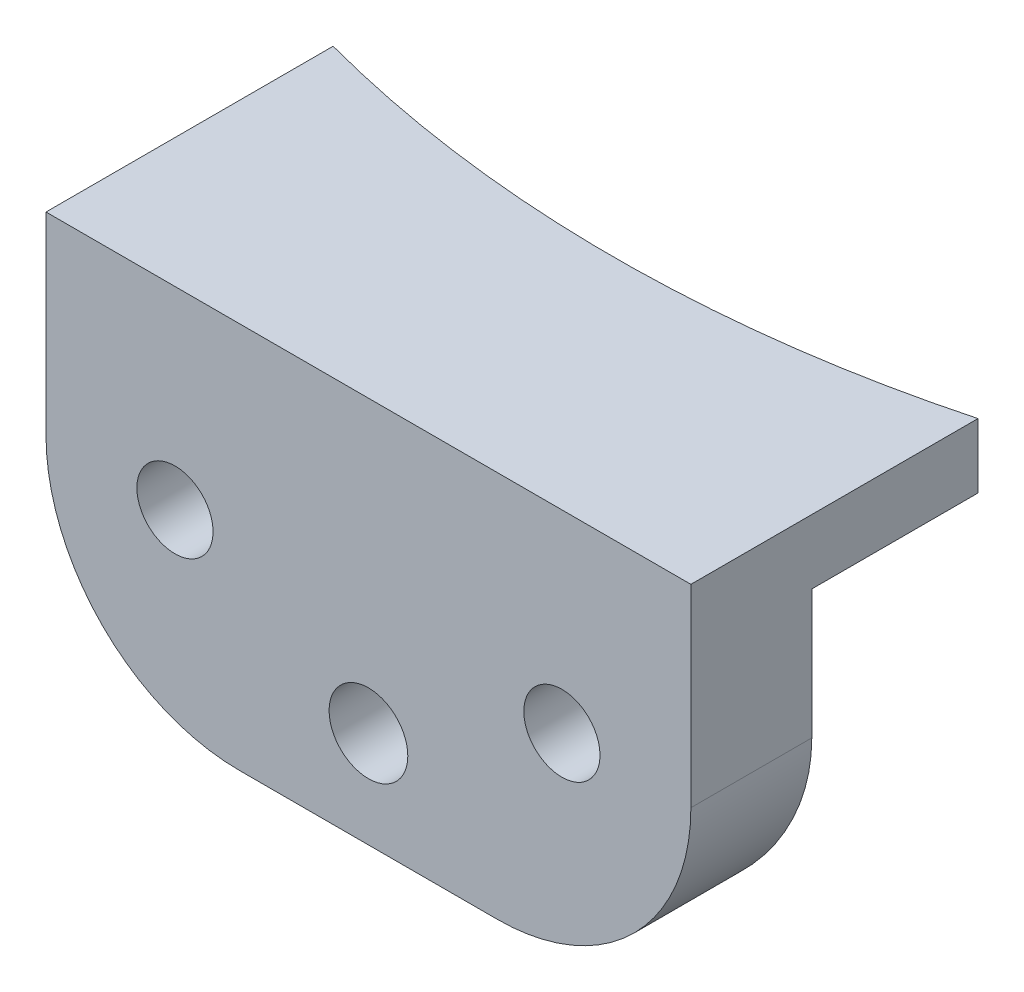
ISO-10303-21;
HEADER;
FILE_DESCRIPTION(('STEP AP214'),'2;1');
FILE_NAME('part.step','',(''),(''),'','','');
FILE_SCHEMA(('AUTOMOTIVE_DESIGN { 1 0 10303 214 1 1 1 1 }'));
ENDSEC;
DATA;
#1=APPLICATION_CONTEXT('core data for automotive mechanical design processes');
#2=APPLICATION_PROTOCOL_DEFINITION('international standard','automotive_design',2000,#1);
#3=PRODUCT_CONTEXT('',#1,'mechanical');
#4=PRODUCT('Part','Part','',(#3));
#5=PRODUCT_RELATED_PRODUCT_CATEGORY('part','',(#4));
#6=PRODUCT_DEFINITION_FORMATION('','',#4);
#7=PRODUCT_DEFINITION_CONTEXT('part definition',#1,'design');
#8=PRODUCT_DEFINITION('design','',#6,#7);
#9=PRODUCT_DEFINITION_SHAPE('','',#8);
#10=(LENGTH_UNIT() NAMED_UNIT(*) SI_UNIT(.MILLI.,.METRE.));
#11=(NAMED_UNIT(*) PLANE_ANGLE_UNIT() SI_UNIT($,.RADIAN.));
#12=(NAMED_UNIT(*) SI_UNIT($,.STERADIAN.) SOLID_ANGLE_UNIT());
#13=UNCERTAINTY_MEASURE_WITH_UNIT(LENGTH_MEASURE(1.E-05),#10,'distance_accuracy_value','');
#14=(GEOMETRIC_REPRESENTATION_CONTEXT(3) GLOBAL_UNCERTAINTY_ASSIGNED_CONTEXT((#13)) GLOBAL_UNIT_ASSIGNED_CONTEXT((#10,
#11,#12)) REPRESENTATION_CONTEXT('',''));
#15=CARTESIAN_POINT('',(0.,0.,0.));
#16=DIRECTION('',(0.,0.,1.));
#17=DIRECTION('',(1.,0.,0.));
#18=AXIS2_PLACEMENT_3D('',#15,#16,#17);
#19=CARTESIAN_POINT('',(0.,12.7,0.));
#20=DIRECTION('',(0.,-1.,0.));
#21=DIRECTION('',(0.,0.,-1.));
#22=AXIS2_PLACEMENT_3D('',#19,#20,#21);
#23=CYLINDRICAL_SURFACE('',#22,55.5625);
#24=CARTESIAN_POINT('',(-9.120000048,7.62,54.8089135576913));
#25=CARTESIAN_POINT('',(-9.11999621102808,7.53655292794151,54.808914369063));
#26=CARTESIAN_POINT('',(-9.1130116596539,7.45304518503125,54.8100778183066));
#27=CARTESIAN_POINT('',(-9.08526335183245,7.28834719222203,54.8146840362341));
#28=CARTESIAN_POINT('',(-9.06448303718543,7.20715984964252,54.8181295439196));
#29=CARTESIAN_POINT('',(-9.00978951623179,7.04952957992192,54.8271453048958));
#30=CARTESIAN_POINT('',(-8.97588675838436,6.97308293414909,54.8327138676975));
#31=CARTESIAN_POINT('',(-8.89597088898424,6.82701224277382,54.8457358352249));
#32=CARTESIAN_POINT('',(-8.84996036921445,6.75738674141171,54.853188836555));
#33=CARTESIAN_POINT('',(-8.74682308996114,6.62638789473792,54.8697296303837));
#34=CARTESIAN_POINT('',(-8.68962455877084,6.56507240342277,54.8788279476088));
#35=CARTESIAN_POINT('',(-8.56594689860326,6.45288523053285,54.8982683825637));
#36=CARTESIAN_POINT('',(-8.49946685646346,6.40201457779287,54.9086106226632));
#37=CARTESIAN_POINT('',(-8.35821882624504,6.31150671653882,54.9302898588455));
#38=CARTESIAN_POINT('',(-8.28335874462302,6.27201576909301,54.9416375490693));
#39=CARTESIAN_POINT('',(-8.12813648430618,6.20617332052651,54.9648156252162));
#40=CARTESIAN_POINT('',(-8.04777401183393,6.17982252159284,54.9766460368985));
#41=CARTESIAN_POINT('',(-7.8830581811966,6.14080220393394,55.0005070953716));
#42=CARTESIAN_POINT('',(-7.79867596702962,6.12825489872769,55.0125385882068));
#43=CARTESIAN_POINT('',(-7.62896594577147,6.11761900363238,55.0363300566384));
#44=CARTESIAN_POINT('',(-7.54363812546803,6.11953061602213,55.048090028434));
#45=CARTESIAN_POINT('',(-7.37433852769907,6.13780253147227,55.0710254674379));
#46=CARTESIAN_POINT('',(-7.2903688021426,6.1541829339868,55.0822000986314));
#47=CARTESIAN_POINT('',(-7.12632355167266,6.20100076410465,55.1036638158295));
#48=CARTESIAN_POINT('',(-7.04624794739732,6.23143790510002,55.1139529198842));
#49=CARTESIAN_POINT('',(-6.89271328707526,6.30536049481368,55.1333644387822));
#50=CARTESIAN_POINT('',(-6.81922296201439,6.3487795088301,55.1424924642665));
#51=CARTESIAN_POINT('',(-6.68056246771594,6.44752373717422,55.1594631773026));
#52=CARTESIAN_POINT('',(-6.61539196462234,6.50284847351224,55.1673059164337));
#53=CARTESIAN_POINT('',(-6.4957676937025,6.62337769766718,55.1815188053812));
#54=CARTESIAN_POINT('',(-6.44123536603558,6.68850293621306,55.1878998159094));
#55=CARTESIAN_POINT('',(-6.34388050871682,6.82710021048834,55.1991756824329));
#56=CARTESIAN_POINT('',(-6.30105753347552,6.90057192844891,55.2040705949811));
#57=CARTESIAN_POINT('',(-6.22864679112167,7.05323280696333,55.2122874979561));
#58=CARTESIAN_POINT('',(-6.19897041654829,7.13237937913618,55.2156200279374));
#59=CARTESIAN_POINT('',(-6.15330431731042,7.29457488825311,55.220727855855));
#60=CARTESIAN_POINT('',(-6.13731423122947,7.37762372208832,55.2225031949124));
#61=CARTESIAN_POINT('',(-6.11953242671802,7.54489110175352,55.2244765509917));
#62=CARTESIAN_POINT('',(-6.11768119187929,7.62910324784874,55.224681179816));
#63=CARTESIAN_POINT('',(-6.12807442800056,7.7966416528179,55.2235288297159));
#64=CARTESIAN_POINT('',(-6.14031873380357,7.8799679220601,55.2221718690886));
#65=CARTESIAN_POINT('',(-6.17852065635988,8.04327528197983,55.2179106240388));
#66=CARTESIAN_POINT('',(-6.2044630596534,8.12325997775687,55.2150080561771));
#67=CARTESIAN_POINT('',(-6.26929091435104,8.27772387211562,55.2076847510786));
#68=CARTESIAN_POINT('',(-6.308176410796,8.35220305153752,55.2032640085586));
#69=CARTESIAN_POINT('',(-6.39784706286642,8.49371212941183,55.1929433196978));
#70=CARTESIAN_POINT('',(-6.44865607028759,8.56072669413083,55.1870404067448));
#71=CARTESIAN_POINT('',(-6.56065466948054,8.68527081342173,55.1738378929584));
#72=CARTESIAN_POINT('',(-6.62184447729637,8.7428001705394,55.1665382630562));
#73=CARTESIAN_POINT('',(-6.7531756981385,8.84706174142647,55.1506157082599));
#74=CARTESIAN_POINT('',(-6.82336057399495,8.89373821129063,55.1419863142163));
#75=CARTESIAN_POINT('',(-6.97042707443464,8.97465871653877,55.1235887639194));
#76=CARTESIAN_POINT('',(-7.04730893701326,9.00890230986346,55.1138205671916));
#77=CARTESIAN_POINT('',(-7.20617478495063,9.06425610064247,55.0932746083916));
#78=CARTESIAN_POINT('',(-7.28819189011866,9.08526869760745,55.082490003281));
#79=CARTESIAN_POINT('',(-7.45449870124348,9.1132248258205,55.0602296795355));
#80=CARTESIAN_POINT('',(-7.53878851298812,9.12016770101464,55.0487539286989));
#81=CARTESIAN_POINT('',(-7.70790703337021,9.11982498652059,55.0253297617587));
#82=CARTESIAN_POINT('',(-7.79273514244896,9.11243430139356,55.0133784885212));
#83=CARTESIAN_POINT('',(-7.9599222586588,9.0834383218984,54.9894369745559));
#84=CARTESIAN_POINT('',(-8.04228118166594,9.06183254380326,54.9774467325159));
#85=CARTESIAN_POINT('',(-8.20251248595899,9.0048953100707,54.9537695066501));
#86=CARTESIAN_POINT('',(-8.28036696096295,8.96951289010585,54.9420838227698));
#87=CARTESIAN_POINT('',(-8.42902662111341,8.88599529703487,54.9194735625234));
#88=CARTESIAN_POINT('',(-8.49983211477352,8.83786068239349,54.9085489528536));
#89=CARTESIAN_POINT('',(-8.63211008475951,8.73034793692299,54.8879090112642));
#90=CARTESIAN_POINT('',(-8.69361404857573,8.67100934107989,54.8781896205283));
#91=CARTESIAN_POINT('',(-8.80577532143928,8.5426066930263,54.8603040664231));
#92=CARTESIAN_POINT('',(-8.85643049777756,8.47354073297715,54.8521382084902));
#93=CARTESIAN_POINT('',(-8.94489321851712,8.3283882145074,54.8377815608655));
#94=CARTESIAN_POINT('',(-8.98282289441274,8.25237786164905,54.8315720329315));
#95=CARTESIAN_POINT('',(-9.04532009021431,8.09498807123796,54.8212969927782));
#96=CARTESIAN_POINT('',(-9.06990496559453,8.01361576242395,54.8172286960081));
#97=CARTESIAN_POINT('',(-9.09826396206031,7.87974052414636,54.8125269419358));
#98=CARTESIAN_POINT('',(-9.1064040030245,7.82814671964131,54.8111744368208));
#99=CARTESIAN_POINT('',(-9.11727322486417,7.72437652074445,54.8093674944471));
#100=CARTESIAN_POINT('',(-9.12000244820928,7.6722001309286,54.8089130501396));
#101=CARTESIAN_POINT('',(-9.120000048,7.62,54.8089135576913));
#102=B_SPLINE_CURVE_WITH_KNOTS('',3,(#24,#25,#26,#27,#28,#29,#30,#31,#32,#33,#34,#35,#36,#37,
#38,#39,#40,#41,#42,#43,#44,#45,#46,#47,#48,#49,#50,#51,#52,#53,#54,#55,#56,#57,#58,#59,#60,#61,
#62,#63,#64,#65,#66,#67,#68,#69,#70,#71,#72,#73,#74,#75,#76,#77,#78,#79,#80,#81,#82,#83,#84,#85,
#86,#87,#88,#89,#90,#91,#92,#93,#94,#95,#96,#97,#98,#99,#100,#101),.UNSPECIFIED.,.T.,.F.,(4,2,2,
2,2,2,2,2,2,2,2,2,2,2,2,2,2,2,2,2,2,2,2,2,2,2,2,2,2,2,2,2,2,2,2,2,2,2,4),(0.,0.25014922180014,
0.500599226325257,0.750850224360897,1.00104769727693,1.25290620658383,1.5047895125035,
1.75977892062891,2.01478195349161,2.27202500441455,2.52927165414888,2.78687622345695,
3.04447554060371,3.30077852312593,3.5570712175423,3.81139296637141,4.06570503585497,
4.31827595943153,4.57084021311309,4.82234072788359,5.07383829586088,5.32505712986663,
5.5762768381013,5.82800343577831,6.0797352730038,6.33273285068457,6.58573942298331,
6.84059112192356,7.09545470401358,7.35219404373389,7.60894212051832,7.86664915756444,
8.12434491055195,8.38114778587567,8.63800109855182,8.892313630998,9.14629462198522,
9.3027761413471,9.45925643247705),.UNSPECIFIED.);
#103=CARTESIAN_POINT('',(-9.120000048,7.62,54.8089135576913));
#104=VERTEX_POINT('',#103);
#105=EDGE_CURVE('E196',#104,#104,#102,.T.);
#106=ORIENTED_EDGE('',*,*,#105,.T.);
#107=EDGE_LOOP('',(#106));
#108=FACE_BOUND('',#107,.T.);
#109=DIRECTION('',(0.,-1.,0.));
#110=VECTOR('',#109,1.);
#111=CARTESIAN_POINT('',(12.7,12.7,54.0916019937476));
#112=LINE('',#111,#110);
#113=CARTESIAN_POINT('',(12.7,12.7,54.0916019937476));
#114=VERTEX_POINT('',#113);
#115=CARTESIAN_POINT('',(12.7,7.62,54.0916019937476));
#116=VERTEX_POINT('',#115);
#117=EDGE_CURVE('E205',#114,#116,#112,.T.);
#118=ORIENTED_EDGE('',*,*,#117,.T.);
#119=CARTESIAN_POINT('',(12.7,7.62,54.0916019937476));
#120=CARTESIAN_POINT('',(12.7000260383111,7.40909228251088,54.0915864318553));
#121=CARTESIAN_POINT('',(12.691244830027,7.19819127799072,54.0936573082442));
#122=CARTESIAN_POINT('',(12.6562582443714,6.77794544077424,54.1018588325241));
#123=CARTESIAN_POINT('',(12.6300551259228,6.56860040988843,54.1079889540934));
#124=CARTESIAN_POINT('',(12.560474630859,6.15330998488749,54.1241820295825));
#125=CARTESIAN_POINT('',(12.5171267660357,5.94735937909786,54.134238225046));
#126=CARTESIAN_POINT('',(12.4136180909257,5.5399487376661,54.158067992428));
#127=CARTESIAN_POINT('',(12.3534572014027,5.33848872319204,54.1718415818658));
#128=CARTESIAN_POINT('',(12.2168079532542,4.94148525143272,54.2028219480953));
#129=CARTESIAN_POINT('',(12.1403214745008,4.74594111589849,54.2200283295903));
#130=CARTESIAN_POINT('',(11.9715783381805,4.36200444670588,54.2575357674463));
#131=CARTESIAN_POINT('',(11.879315869091,4.17361457988681,54.2778379639371));
#132=CARTESIAN_POINT('',(11.6797396456503,3.80533099853923,54.3211331557491));
#133=CARTESIAN_POINT('',(11.5724271486034,3.62543657596365,54.3441259262686));
#134=CARTESIAN_POINT('',(11.3435177564406,3.27529069917125,54.3923679206215));
#135=CARTESIAN_POINT('',(11.2219202556919,3.10503965425281,54.4176172401135));
#136=CARTESIAN_POINT('',(10.9633778569664,2.77281235446111,54.4702984176426));
#137=CARTESIAN_POINT('',(10.8262309491043,2.61099756682606,54.4977572300912));
#138=CARTESIAN_POINT('',(10.5390618609498,2.29948099987531,54.5540189504993));
#139=CARTESIAN_POINT('',(10.3890395653597,2.14977932905461,54.582821870494));
#140=CARTESIAN_POINT('',(10.0771038349884,1.8634220081827,54.6412716227664));
#141=CARTESIAN_POINT('',(9.91518741183268,1.72676965671743,54.6709186659745));
#142=CARTESIAN_POINT('',(9.58058466826317,1.46744437189491,54.7305461139997));
#143=CARTESIAN_POINT('',(9.4078984566224,1.34477129738477,54.7605265154474));
#144=CARTESIAN_POINT('',(9.04939130935338,1.11193492361699,54.8209230629937));
#145=CARTESIAN_POINT('',(8.86337847874969,1.00206611026263,54.8513361394482));
#146=CARTESIAN_POINT('',(8.48268523645505,0.798510974926254,54.9114977279068));
#147=CARTESIAN_POINT('',(8.28800786856427,0.704819025671001,54.9412464678585));
#148=CARTESIAN_POINT('',(7.89131299014792,0.534274703167012,54.9996249202243));
#149=CARTESIAN_POINT('',(7.68929784430577,0.457416960058029,55.0282549870771));
#150=CARTESIAN_POINT('',(7.27936153832026,0.321103346367203,55.0839825765294));
#151=CARTESIAN_POINT('',(7.07144172028111,0.261643555497589,55.1110804432681));
#152=CARTESIAN_POINT('',(6.57017863524608,0.141148151241185,55.1734529444688));
#153=CARTESIAN_POINT('',(6.27469938158129,0.0882796324289929,55.2078704229079));
#154=CARTESIAN_POINT('',(5.82835833976299,0.0353549150312618,55.2561682371208));
#155=CARTESIAN_POINT('',(5.67910944207982,0.0221097115495181,55.2717080069023));
#156=CARTESIAN_POINT('',(5.37994052929068,0.00443212993861692,55.301629822507));
#157=CARTESIAN_POINT('',(5.23002036829238,1.77112671882109E-06,55.3160116023325));
#158=CARTESIAN_POINT('',(5.08000000000001,0.,55.3297840791919));
#159=B_SPLINE_CURVE_WITH_KNOTS('',3,(#119,#120,#121,#122,#123,#124,#125,#126,#127,#128,#129,
#130,#131,#132,#133,#134,#135,#136,#137,#138,#139,#140,#141,#142,#143,#144,#145,#146,#147,#148,
#149,#150,#151,#152,#153,#154,#155,#156,#157,#158),.UNSPECIFIED.,.F.,.F.,(4,2,2,2,2,2,2,2,2,2,2,
2,2,2,2,2,2,2,2,4),(0.,0.632520161662018,1.26495832682647,1.8963125613406,2.52766977134909,
3.15895432051167,3.79047192379489,4.42193680044215,5.05342845859494,5.69434709735375,
6.33527147606941,6.9763574401194,7.61743693036134,8.27116176835798,8.9246587418963,
9.57794695509437,10.2310878490261,11.1351016113192,11.5867982394864,12.0385983310567),.UNSPECIFIED.);
#160=CARTESIAN_POINT('',(5.08000000000001,0.,55.3297840791919));
#161=VERTEX_POINT('',#160);
#162=EDGE_CURVE('E52',#116,#161,#159,.T.);
#163=ORIENTED_EDGE('',*,*,#162,.T.);
#164=CARTESIAN_POINT('',(0.,0.,0.));
#165=DIRECTION('',(0.,1.,0.));
#166=DIRECTION('',(0.,0.,1.));
#167=AXIS2_PLACEMENT_3D('',#164,#165,#166);
#168=CIRCLE('',#167,55.5625);
#169=CARTESIAN_POINT('',(-5.07999999999999,0.,55.3297840791919));
#170=VERTEX_POINT('',#169);
#171=EDGE_CURVE('E199',#170,#161,#168,.T.);
#172=ORIENTED_EDGE('',*,*,#171,.F.);
#173=CARTESIAN_POINT('',(-5.07999999999999,0.,55.3297840791919));
#174=CARTESIAN_POINT('',(-5.29562410537944,-2.3387445512298E-05,55.3099997188466));
#175=CARTESIAN_POINT('',(-5.51112042097036,0.00915118387227308,55.28893094684));
#176=CARTESIAN_POINT('',(-5.94029978490938,0.0456641324498058,55.2444603897414));
#177=CARTESIAN_POINT('',(-6.15398306005883,0.0730002028392074,55.2210589012716));
#178=CARTESIAN_POINT('',(-6.57777677106924,0.145560073441101,55.17218326696));
#179=CARTESIAN_POINT('',(-6.78789122985313,0.190762115183339,55.1467116721074));
#180=CARTESIAN_POINT('',(-7.20334697324967,0.298671325154473,55.0939835295491));
#181=CARTESIAN_POINT('',(-7.40868821288622,0.36137865825626,55.0667269650336));
#182=CARTESIAN_POINT('',(-7.81316032874045,0.503806931061598,55.0107954997));
#183=CARTESIAN_POINT('',(-8.0122917751137,0.583526303492762,54.9821207297242));
#184=CARTESIAN_POINT('',(-8.40307988269979,0.759426332809615,54.9237535370508));
#185=CARTESIAN_POINT('',(-8.59473376381003,0.855613041848489,54.8940607434247));
#186=CARTESIAN_POINT('',(-8.96916473472196,1.06373055449219,54.8341265856855));
#187=CARTESIAN_POINT('',(-9.15194314337477,1.17565900926147,54.803885303998));
#188=CARTESIAN_POINT('',(-9.50742384205972,1.41450459468329,54.7433357867528));
#189=CARTESIAN_POINT('',(-9.6801258709567,1.54142211352848,54.7130275494811));
#190=CARTESIAN_POINT('',(-10.0157436611376,1.8105672966892,54.6525902226809));
#191=CARTESIAN_POINT('',(-10.178560274216,1.95291950983817,54.6224650375705));
#192=CARTESIAN_POINT('',(-10.4916022900358,2.2510448399384,54.5632025409557));
#193=CARTESIAN_POINT('',(-10.6418276177546,2.40681803684473,54.534065235338));
#194=CARTESIAN_POINT('',(-10.9286385521242,2.73076335238247,54.4773131355335));
#195=CARTESIAN_POINT('',(-11.0652217035749,2.89893769343099,54.4496986158036));
#196=CARTESIAN_POINT('',(-11.3237088821085,3.24651137039552,54.3965296708766));
#197=CARTESIAN_POINT('',(-11.4456134757626,3.42591027265331,54.3709751661785));
#198=CARTESIAN_POINT('',(-11.6733659620802,3.79396175448207,54.322531608219));
#199=CARTESIAN_POINT('',(-11.779276353217,3.98257429146174,54.2996322657756));
#200=CARTESIAN_POINT('',(-11.9747598790164,4.36831989412749,54.2568571196159));
#201=CARTESIAN_POINT('',(-12.0643394035554,4.56544958974535,54.2369801338313));
#202=CARTESIAN_POINT('',(-12.2264480386432,4.96679723694908,54.2006667902396));
#203=CARTESIAN_POINT('',(-12.298985918394,5.17101148064087,54.1842286633611));
#204=CARTESIAN_POINT('',(-12.4264455428757,5.58503866064816,54.1551393616813));
#205=CARTESIAN_POINT('',(-12.481372311498,5.79484998176211,54.1424871069596));
#206=CARTESIAN_POINT('',(-12.5846109902038,6.27148553512671,54.1185967336665));
#207=CARTESIAN_POINT('',(-12.6278666930291,6.53949244771971,54.1084960034694));
#208=CARTESIAN_POINT('',(-12.6711345757469,6.94364739409365,54.0983727821397));
#209=CARTESIAN_POINT('',(-12.6819545804616,7.07867117232856,54.0958363640718));
#210=CARTESIAN_POINT('',(-12.6963868481978,7.34911939552043,54.0924504850006));
#211=CARTESIAN_POINT('',(-12.6999993811438,7.48454382528249,54.0916009608221));
#212=CARTESIAN_POINT('',(-12.7,7.62,54.0916019937476));
#213=B_SPLINE_CURVE_WITH_KNOTS('',3,(#173,#174,#175,#176,#177,#178,#179,#180,#181,#182,#183,
#184,#185,#186,#187,#188,#189,#190,#191,#192,#193,#194,#195,#196,#197,#198,#199,#200,#201,#202,
#203,#204,#205,#206,#207,#208,#209,#210,#211,#212),.UNSPECIFIED.,.F.,.F.,(4,2,2,2,2,2,2,2,2,2,2,
2,2,2,2,2,2,2,2,4),(0.,0.649377166381036,1.2986718647569,1.94717822973769,2.59569070285607,
3.24414345607736,3.89283504534495,4.5414299454298,5.19004164676454,5.844343678106,
6.4986496077006,7.15307308220284,7.80747128880387,8.45924226245724,9.11075766384159,
9.76193707386063,10.4129305574326,11.2260902634517,11.6323599716372,12.0386144644754),.UNSPECIFIED.);
#214=CARTESIAN_POINT('',(-12.7,7.62,54.0916019937476));
#215=VERTEX_POINT('',#214);
#216=EDGE_CURVE('E59',#170,#215,#213,.T.);
#217=ORIENTED_EDGE('',*,*,#216,.T.);
#218=DIRECTION('',(0.,-1.,0.));
#219=VECTOR('',#218,1.);
#220=CARTESIAN_POINT('',(-12.7,12.7,54.0916019937476));
#221=LINE('',#220,#219);
#222=CARTESIAN_POINT('',(-12.7,12.7,54.0916019937476));
#223=VERTEX_POINT('',#222);
#224=EDGE_CURVE('E121',#223,#215,#221,.T.);
#225=ORIENTED_EDGE('',*,*,#224,.F.);
#226=CARTESIAN_POINT('',(0.,12.7,0.));
#227=DIRECTION('',(0.,1.,0.));
#228=DIRECTION('',(0.,0.,1.));
#229=AXIS2_PLACEMENT_3D('',#226,#227,#228);
#230=CIRCLE('',#229,55.5625);
#231=EDGE_CURVE('E122',#223,#114,#230,.T.);
#232=ORIENTED_EDGE('',*,*,#231,.T.);
#233=EDGE_LOOP('',(#118,#163,#172,#217,#225,#232));
#234=FACE_BOUND('',#233,.T.);
#235=CARTESIAN_POINT('',(6.119999952,7.62,55.2244240063898));
#236=CARTESIAN_POINT('',(6.12000371731656,7.70384911757433,55.2244237614702));
#237=CARTESIAN_POINT('',(6.12705488577725,7.78775884632044,55.2236435883633));
#238=CARTESIAN_POINT('',(6.15507775222119,7.95326138606132,55.2205271175357));
#239=CARTESIAN_POINT('',(6.17606611345703,8.03485130158077,55.21818895708));
#240=CARTESIAN_POINT('',(6.23134089348511,8.19328710860472,55.2119784627386));
#241=CARTESIAN_POINT('',(6.26561961049595,8.27013571786113,55.208107017366));
#242=CARTESIAN_POINT('',(6.34646219195674,8.41694635401635,55.1988720084782));
#243=CARTESIAN_POINT('',(6.39302309548422,8.48691003512194,55.193508804571));
#244=CARTESIAN_POINT('',(6.49720301893745,8.6181806596991,55.1813420252037));
#245=CARTESIAN_POINT('',(6.55484793560669,8.67946673474614,55.1745350726457));
#246=CARTESIAN_POINT('',(6.67945853919748,8.79149585102086,55.1595881945335));
#247=CARTESIAN_POINT('',(6.74642481230449,8.84223822869394,55.1514481851427));
#248=CARTESIAN_POINT('',(6.88817667682041,8.93206570640083,55.133923770131));
#249=CARTESIAN_POINT('',(6.96300581309714,8.97108071180503,55.1245323480741));
#250=CARTESIAN_POINT('',(7.1180206576917,9.03600817991073,55.1047301847482));
#251=CARTESIAN_POINT('',(7.19820657502636,9.06192013100428,55.0943194036972));
#252=CARTESIAN_POINT('',(7.36230524458389,9.10011628138092,55.07263172448));
#253=CARTESIAN_POINT('',(7.44624178712253,9.11229486496705,55.0613488174972));
#254=CARTESIAN_POINT('',(7.6148991048308,9.1223687214044,55.0382772492283));
#255=CARTESIAN_POINT('',(7.69961991249936,9.12026339967913,55.0264885669092));
#256=CARTESIAN_POINT('',(7.8680395448931,9.10178961240356,55.0026603180449));
#257=CARTESIAN_POINT('',(7.95172782244038,9.08532636073442,54.9906196042509));
#258=CARTESIAN_POINT('',(8.11514256208299,9.03847077901288,54.9667416820578));
#259=CARTESIAN_POINT('',(8.19486892777359,9.00807811020147,54.9549044786153));
#260=CARTESIAN_POINT('',(8.34823425074134,8.93412889579789,54.9318161124789));
#261=CARTESIAN_POINT('',(8.42186232522994,8.89054943590729,54.9205660101945));
#262=CARTESIAN_POINT('',(8.56075041279862,8.79143775105458,54.8990883764091));
#263=CARTESIAN_POINT('',(8.62601060802323,8.73590578633442,54.8888608226511));
#264=CARTESIAN_POINT('',(8.74588871435486,8.6147827514937,54.8698870699567));
#265=CARTESIAN_POINT('',(8.80056648060806,8.54925224458237,54.8611325783816));
#266=CARTESIAN_POINT('',(8.89811094428881,8.40973172755988,54.8453961353485));
#267=CARTESIAN_POINT('',(8.94097842120882,8.33574227620494,54.838414066911));
#268=CARTESIAN_POINT('',(9.01315738453678,8.18232986303454,54.8265969096645));
#269=CARTESIAN_POINT('',(9.04262190309225,8.10298077024724,54.821737610324));
#270=CARTESIAN_POINT('',(9.08781737264019,7.94036309728095,54.8142637609483));
#271=CARTESIAN_POINT('',(9.10354931563693,7.85709480067274,54.8116490487703));
#272=CARTESIAN_POINT('',(9.12069193401878,7.68999738248732,54.8087991160742));
#273=CARTESIAN_POINT('',(9.1222601897678,7.60618484098529,54.8085377135388));
#274=CARTESIAN_POINT('',(9.11143977185135,7.43949296308535,54.810337534858));
#275=CARTESIAN_POINT('',(9.09905153392604,7.35661359763405,54.8123986861994));
#276=CARTESIAN_POINT('',(9.06076780780896,7.19443381441877,54.8187400769808));
#277=CARTESIAN_POINT('',(9.0349195582726,7.11512192720396,54.8230125553305));
#278=CARTESIAN_POINT('',(8.97052287672623,6.9619813814523,54.833586278161));
#279=CARTESIAN_POINT('',(8.93197412701045,6.88815286013967,54.839887573393));
#280=CARTESIAN_POINT('',(8.84302757044934,6.7475506431167,54.8543006939865));
#281=CARTESIAN_POINT('',(8.79255583866518,6.68082488986363,54.8624237983577));
#282=CARTESIAN_POINT('',(8.6813608909769,6.55677239809934,54.8801288379356));
#283=CARTESIAN_POINT('',(8.62063703778261,6.49944624432095,54.8897108638277));
#284=CARTESIAN_POINT('',(8.48986557786433,6.39508545876161,54.9100902546704));
#285=CARTESIAN_POINT('',(8.41971451612138,6.34818304648185,54.920900863234));
#286=CARTESIAN_POINT('',(8.27264349246052,6.26681089808908,54.9432461962801));
#287=CARTESIAN_POINT('',(8.19572312279707,6.2323419115351,54.9547809643699));
#288=CARTESIAN_POINT('',(8.03641281237598,6.17646264717463,54.9783049950258));
#289=CARTESIAN_POINT('',(7.95397387796316,6.15519344207191,54.9902977604776));
#290=CARTESIAN_POINT('',(7.78668039804671,6.12687723626687,55.0142359095637));
#291=CARTESIAN_POINT('',(7.70182577777469,6.11983067625903,55.0261812917185));
#292=CARTESIAN_POINT('',(7.5317661737021,6.12017605503529,55.0497166212871));
#293=CARTESIAN_POINT('',(7.4465610793216,6.12762273950597,55.0613050524015));
#294=CARTESIAN_POINT('',(7.27855757368912,6.15689121340597,55.0837652215557));
#295=CARTESIAN_POINT('',(7.19575913915165,6.17871286370284,55.0946369665311));
#296=CARTESIAN_POINT('',(7.03523419476713,6.23606038319239,55.1153646384307));
#297=CARTESIAN_POINT('',(6.95749156682349,6.27153992552357,55.1252238581024));
#298=CARTESIAN_POINT('',(6.80904581055884,6.35524204378955,55.143756701438));
#299=CARTESIAN_POINT('',(6.73834215204492,6.40346365895802,55.1524304144156));
#300=CARTESIAN_POINT('',(6.60655160855841,6.51090238307935,55.1683719558775));
#301=CARTESIAN_POINT('',(6.54539736353703,6.57003539231792,55.1756497230196));
#302=CARTESIAN_POINT('',(6.43387095984251,6.69788629740638,55.1887658229102));
#303=CARTESIAN_POINT('',(6.38350105665956,6.76660619335099,55.194603854584));
#304=CARTESIAN_POINT('',(6.29537120482434,6.91114364249071,55.204725052693));
#305=CARTESIAN_POINT('',(6.25752656286639,6.98690889422442,55.2090186799864));
#306=CARTESIAN_POINT('',(6.19512698152663,7.14372176070107,55.216055667924));
#307=CARTESIAN_POINT('',(6.17055563365224,7.22476271401913,55.2188009428328));
#308=CARTESIAN_POINT('',(6.14201465203281,7.35860982950822,55.2219808989417));
#309=CARTESIAN_POINT('',(6.1337698354677,7.41053209140411,55.2228965647646));
#310=CARTESIAN_POINT('',(6.12276131383579,7.51496164009855,55.2241181943347));
#311=CARTESIAN_POINT('',(6.11999759304702,7.56746892521859,55.2244241598307));
#312=CARTESIAN_POINT('',(6.119999952,7.62,55.2244240063898));
#313=B_SPLINE_CURVE_WITH_KNOTS('',3,(#235,#236,#237,#238,#239,#240,#241,#242,#243,#244,#245,
#246,#247,#248,#249,#250,#251,#252,#253,#254,#255,#256,#257,#258,#259,#260,#261,#262,#263,#264,
#265,#266,#267,#268,#269,#270,#271,#272,#273,#274,#275,#276,#277,#278,#279,#280,#281,#282,#283,
#284,#285,#286,#287,#288,#289,#290,#291,#292,#293,#294,#295,#296,#297,#298,#299,#300,#301,#302,
#303,#304,#305,#306,#307,#308,#309,#310,#311,#312),.UNSPECIFIED.,.T.,.F.,(4,2,2,2,2,2,2,2,2,2,2,
2,2,2,2,2,2,2,2,2,2,2,2,2,2,2,2,2,2,2,2,2,2,2,2,2,2,2,4),(0.,0.251355146459634,
0.503011354521981,0.754521944878947,1.00597195776034,1.25801675951987,1.51007741860735,
1.76361598655417,2.01716445313449,2.27264979862722,2.52814577892227,2.78534133363927,
3.04254314360262,3.30019447746106,3.55784020204283,3.8139831023575,4.07010909289871,
4.32323238593749,4.57633739251771,4.82662292218212,5.07690063781821,5.32630585152127,
5.57571730462374,5.8267177421904,6.07773378814094,6.33177205621674,6.58582563663413,
6.84254965614398,7.09928163023066,7.35698524658097,7.61468636870563,7.87152097636981,
8.12833622394515,8.38324901118247,8.63821506016505,8.89142007300641,9.1443113524185,
9.3017846121462,9.45925742017735),.UNSPECIFIED.);
#314=CARTESIAN_POINT('',(6.119999952,7.62,55.2244240063898));
#315=VERTEX_POINT('',#314);
#316=EDGE_CURVE('E187',#315,#315,#313,.T.);
#317=ORIENTED_EDGE('',*,*,#316,.F.);
#318=EDGE_LOOP('',(#317));
#319=FACE_BOUND('',#318,.T.);
#320=CARTESIAN_POINT('',(-1.549999948,3.81,55.5408759960734));
#321=CARTESIAN_POINT('',(-1.54999609342308,3.72295399858556,55.5408762879376));
#322=CARTESIAN_POINT('',(-1.54264274943833,3.63584531172755,55.5410828273719));
#323=CARTESIAN_POINT('',(-1.51341154088029,3.4640282034798,55.5418868719789));
#324=CARTESIAN_POINT('',(-1.49151630866288,3.37932277863846,55.5424848446351));
#325=CARTESIAN_POINT('',(-1.43382623459725,3.21482617714643,55.5440039648012));
#326=CARTESIAN_POINT('',(-1.39803817080387,3.13503262604408,55.5449249546958));
#327=CARTESIAN_POINT('',(-1.31358799072566,2.9826082573854,55.5469861305193));
#328=CARTESIAN_POINT('',(-1.26492902506042,2.90997569288289,55.5481262627864));
#329=CARTESIAN_POINT('',(-1.15609444900336,2.77388260417837,55.5504978075962));
#330=CARTESIAN_POINT('',(-1.09591483952437,2.71042527838367,55.5517292517442));
#331=CARTESIAN_POINT('',(-0.96575402580595,2.5945108251007,55.5541443396033));
#332=CARTESIAN_POINT('',(-0.895772432158447,2.54205413484676,55.555327981413));
#333=CARTESIAN_POINT('',(-0.747983265369765,2.44962576246726,55.5575141755787));
#334=CARTESIAN_POINT('',(-0.670174563569678,2.40965588434542,55.5585167017595));
#335=CARTESIAN_POINT('',(-0.50894795551528,2.34334752685525,55.5602274195025));
#336=CARTESIAN_POINT('',(-0.425530070230744,2.3170089965297,55.5609356121649));
#337=CARTESIAN_POINT('',(-0.25547612504719,2.27871755060328,55.5619776666209));
#338=CARTESIAN_POINT('',(-0.168840913604445,2.26676086968102,55.562311626391));
#339=CARTESIAN_POINT('',(0.00520760469671878,2.25756093395939,55.5625678972344));
#340=CARTESIAN_POINT('',(0.0926209086801756,2.26031762481834,55.562490209828));
#341=CARTESIAN_POINT('',(0.265718751092176,2.28046298643949,55.5619320279844));
#342=CARTESIAN_POINT('',(0.351403763508657,2.29784758801998,55.5614516455687));
#343=CARTESIAN_POINT('',(0.518638680263154,2.3467489937465,55.5601423456397));
#344=CARTESIAN_POINT('',(0.600188576151127,2.37826582677022,55.5593134274143));
#345=CARTESIAN_POINT('',(0.756851416373593,2.45454171233959,55.5574002904637));
#346=CARTESIAN_POINT('',(0.83196345211507,2.49930263010373,55.5563160357828));
#347=CARTESIAN_POINT('',(0.973608433072614,2.60079468871591,55.5540144253013));
#348=CARTESIAN_POINT('',(1.04014136180373,2.65752585256449,55.5527970692449));
#349=CARTESIAN_POINT('',(1.16276322857611,2.7813710499755,55.5503659657128));
#350=CARTESIAN_POINT('',(1.21884859959014,2.84848861541882,55.5491522196082));
#351=CARTESIAN_POINT('',(1.31895582339724,2.99118892337766,55.5468655925454));
#352=CARTESIAN_POINT('',(1.36297767427109,3.06677166723991,55.5457927116096));
#353=CARTESIAN_POINT('',(1.43770783347422,3.22425879138393,55.5439088168706));
#354=CARTESIAN_POINT('',(1.46841602769312,3.30616322584136,55.5430978053119));
#355=CARTESIAN_POINT('',(1.51564488496599,3.47396784108615,55.5418291896697));
#356=CARTESIAN_POINT('',(1.5321655815466,3.55986801243064,55.541371584751));
#357=CARTESIAN_POINT('',(1.5505461049613,3.73319466341868,55.540861529535));
#358=CARTESIAN_POINT('',(1.55241087244346,3.82062061874487,55.5408089427024));
#359=CARTESIAN_POINT('',(1.54143947703649,3.994544363316,55.5411144968327));
#360=CARTESIAN_POINT('',(1.52860332878562,4.08104215348506,55.5414726373865));
#361=CARTESIAN_POINT('',(1.48859856695704,4.25064041318624,55.542559148112));
#362=CARTESIAN_POINT('',(1.46143219727584,4.33374141241012,55.5432874603198));
#363=CARTESIAN_POINT('',(1.3935404285462,4.49420339634853,55.5450321611219));
#364=CARTESIAN_POINT('',(1.352815006138,4.57156437117377,55.5460485502126));
#365=CARTESIAN_POINT('',(1.25894844930174,4.71837305537129,55.5482551590617));
#366=CARTESIAN_POINT('',(1.20580398695866,4.78781863623105,55.5494454253817));
#367=CARTESIAN_POINT('',(1.08861281880461,4.91680384197243,55.5518654423468));
#368=CARTESIAN_POINT('',(1.02456608833954,4.97634344445234,55.5530951930813));
#369=CARTESIAN_POINT('',(0.887367290917661,5.08384304617487,55.5554559438528));
#370=CARTESIAN_POINT('',(0.81421272685807,5.13179985911166,55.5565869166625));
#371=CARTESIAN_POINT('',(0.660887630077876,5.21475076249205,55.5586222310486));
#372=CARTESIAN_POINT('',(0.580717112029712,5.24974488004367,55.559526573099));
#373=CARTESIAN_POINT('',(0.415647881765206,5.30577145520478,55.5610065510763));
#374=CARTESIAN_POINT('',(0.330749871485956,5.32680597957216,55.5615822356602));
#375=CARTESIAN_POINT('',(0.158625630224084,5.35432305618019,55.5623401960945));
#376=CARTESIAN_POINT('',(0.0713994004361376,5.36080561588771,55.5625224721467));
#377=CARTESIAN_POINT('',(-0.102873323572012,5.3590345006712,55.5624730706783));
#378=CARTESIAN_POINT('',(-0.189919868941074,5.35078585026795,55.5622415343007));
#379=CARTESIAN_POINT('',(-0.361392132182456,5.31979678795334,55.5613908760816));
#380=CARTESIAN_POINT('',(-0.445817844853064,5.29705634728127,55.5607717534708));
#381=CARTESIAN_POINT('',(-0.609654018374143,5.23772983718235,55.5592156661925));
#382=CARTESIAN_POINT('',(-0.689064393434429,5.20114353098896,55.5582786960898));
#383=CARTESIAN_POINT('',(-0.840613805404238,5.115165791625,55.5561925019119));
#384=CARTESIAN_POINT('',(-0.912753108190607,5.06577482691062,55.5550432856022));
#385=CARTESIAN_POINT('',(-1.04773517858151,4.95557584161627,55.5526617158147));
#386=CARTESIAN_POINT('',(-1.11057576144079,4.89476514554809,55.5514293428979));
#387=CARTESIAN_POINT('',(-1.22517297410786,4.76343926015758,55.5490202639785));
#388=CARTESIAN_POINT('',(-1.27692685410335,4.69292167036163,55.5478435718425));
#389=CARTESIAN_POINT('',(-1.36788920752996,4.54415821713552,55.5456781700201));
#390=CARTESIAN_POINT('',(-1.4070898177431,4.4659075497943,55.5446895783142));
#391=CARTESIAN_POINT('',(-1.47175152849468,4.30399326718506,55.543014050582));
#392=CARTESIAN_POINT('',(-1.49722902485511,4.22033624571266,55.5423267547631));
#393=CARTESIAN_POINT('',(-1.52696430802899,4.08179178077485,55.5415151746475));
#394=CARTESIAN_POINT('',(-1.53559181559179,4.02780373617808,55.5412765228429));
#395=CARTESIAN_POINT('',(-1.54711084422873,3.91921868864245,55.540956842003));
#396=CARTESIAN_POINT('',(-1.55000236676119,3.86462168585841,55.5408758129275));
#397=CARTESIAN_POINT('',(-1.549999948,3.81,55.5408759960734));
#398=B_SPLINE_CURVE_WITH_KNOTS('',3,(#320,#321,#322,#323,#324,#325,#326,#327,#328,#329,#330,
#331,#332,#333,#334,#335,#336,#337,#338,#339,#340,#341,#342,#343,#344,#345,#346,#347,#348,#349,
#350,#351,#352,#353,#354,#355,#356,#357,#358,#359,#360,#361,#362,#363,#364,#365,#366,#367,#368,
#369,#370,#371,#372,#373,#374,#375,#376,#377,#378,#379,#380,#381,#382,#383,#384,#385,#386,#387,
#388,#389,#390,#391,#392,#393,#394,#395,#396,#397),.UNSPECIFIED.,.T.,.F.,(4,2,2,2,2,2,2,2,2,2,2,
2,2,2,2,2,2,2,2,2,2,2,2,2,2,2,2,2,2,2,2,2,2,2,2,2,2,2,4),(0.,0.260938628906029,
0.522189463369566,0.783312998262134,1.04437267276583,1.30552313209716,1.5666839692212,
1.8278825195319,2.08908009341352,2.3502092680928,2.61133747833031,2.87239307211568,
3.13344919934247,3.39454210968265,3.65563552171132,3.91681791407,4.17800034798097,
4.43918502042358,4.70036907565607,4.96146507957072,5.22256082350241,5.48361569590997,
5.7446710180695,6.005796375287,6.26692232301459,6.52812002218735,6.78931717513136,
7.05047564845389,7.31163398777135,7.57270326822043,7.833773066795,8.09484732990718,
8.35591204301066,8.6170379965172,8.8782286417654,9.13958257513029,9.40062355682873,
9.56436354727606,9.72810349609427),.UNSPECIFIED.);
#399=CARTESIAN_POINT('',(-1.549999948,3.81,55.5408759960734));
#400=VERTEX_POINT('',#399);
#401=EDGE_CURVE('E156',#400,#400,#398,.T.);
#402=ORIENTED_EDGE('',*,*,#401,.T.);
#403=EDGE_LOOP('',(#402));
#404=FACE_BOUND('',#403,.T.);
#405=ADVANCED_FACE('F43',(#108,#234,#319,#404),#23,.F.);
#406=CARTESIAN_POINT('',(0.,12.7,58.8541019937476));
#407=DIRECTION('',(0.,0.,-1.));
#408=DIRECTION('',(-1.,0.,0.));
#409=AXIS2_PLACEMENT_3D('',#406,#407,#408);
#410=PLANE('',#409);
#411=CARTESIAN_POINT('',(0.,3.81,58.8541019937476));
#412=DIRECTION('',(0.,0.,1.));
#413=DIRECTION('',(1.,0.,0.));
#414=AXIS2_PLACEMENT_3D('',#411,#412,#413);
#415=CIRCLE('',#414,1.549999948);
#416=CARTESIAN_POINT('',(1.549999948,3.81,58.8541019937476));
#417=VERTEX_POINT('',#416);
#418=EDGE_CURVE('E153',#417,#417,#415,.T.);
#419=ORIENTED_EDGE('',*,*,#418,.F.);
#420=EDGE_LOOP('',(#419));
#421=FACE_BOUND('',#420,.T.);
#422=CARTESIAN_POINT('',(7.62,7.62,58.8541019937476));
#423=DIRECTION('',(0.,0.,-1.));
#424=DIRECTION('',(-1.,0.,0.));
#425=AXIS2_PLACEMENT_3D('',#422,#423,#424);
#426=CIRCLE('',#425,1.500000048);
#427=CARTESIAN_POINT('',(6.119999952,7.62,58.8541019937476));
#428=VERTEX_POINT('',#427);
#429=EDGE_CURVE('E164',#428,#428,#426,.F.);
#430=ORIENTED_EDGE('',*,*,#429,.F.);
#431=EDGE_LOOP('',(#430));
#432=FACE_BOUND('',#431,.T.);
#433=CARTESIAN_POINT('',(-7.62,7.62,58.8541019937476));
#434=DIRECTION('',(0.,0.,-1.));
#435=DIRECTION('',(-1.,0.,0.));
#436=AXIS2_PLACEMENT_3D('',#433,#434,#435);
#437=CIRCLE('',#436,1.500000048);
#438=CARTESIAN_POINT('',(-9.120000048,7.62,58.8541019937476));
#439=VERTEX_POINT('',#438);
#440=EDGE_CURVE('E193',#439,#439,#437,.T.);
#441=ORIENTED_EDGE('',*,*,#440,.T.);
#442=EDGE_LOOP('',(#441));
#443=FACE_BOUND('',#442,.T.);
#444=DIRECTION('',(1.,0.,0.));
#445=VECTOR('',#444,1.);
#446=CARTESIAN_POINT('',(0.,0.,58.8541019937476));
#447=LINE('',#446,#445);
#448=CARTESIAN_POINT('',(-5.07999999999999,0.,58.8541019937476));
#449=VERTEX_POINT('',#448);
#450=CARTESIAN_POINT('',(5.08000000000001,0.,58.8541019937476));
#451=VERTEX_POINT('',#450);
#452=EDGE_CURVE('E200',#449,#451,#447,.T.);
#453=ORIENTED_EDGE('',*,*,#452,.T.);
#454=CARTESIAN_POINT('',(5.08000000000001,7.62,58.8541019937476));
#455=DIRECTION('',(0.,0.,-1.));
#456=DIRECTION('',(-1.,0.,0.));
#457=AXIS2_PLACEMENT_3D('',#454,#455,#456);
#458=CIRCLE('',#457,7.62);
#459=CARTESIAN_POINT('',(12.7,7.62,58.8541019937476));
#460=VERTEX_POINT('',#459);
#461=EDGE_CURVE('E220',#451,#460,#458,.F.);
#462=ORIENTED_EDGE('',*,*,#461,.T.);
#463=DIRECTION('',(0.,-1.,0.));
#464=VECTOR('',#463,1.);
#465=CARTESIAN_POINT('',(12.7,12.7,58.8541019937476));
#466=LINE('',#465,#464);
#467=CARTESIAN_POINT('',(12.7,15.24,58.8541019937476));
#468=VERTEX_POINT('',#467);
#469=EDGE_CURVE('E128',#468,#460,#466,.T.);
#470=ORIENTED_EDGE('',*,*,#469,.F.);
#471=DIRECTION('',(1.,0.,0.));
#472=VECTOR('',#471,1.);
#473=CARTESIAN_POINT('',(0.,15.24,58.8541019937476));
#474=LINE('',#473,#472);
#475=CARTESIAN_POINT('',(-12.7,15.24,58.8541019937476));
#476=VERTEX_POINT('',#475);
#477=EDGE_CURVE('E125',#476,#468,#474,.T.);
#478=ORIENTED_EDGE('',*,*,#477,.F.);
#479=DIRECTION('',(0.,-1.,0.));
#480=VECTOR('',#479,1.);
#481=CARTESIAN_POINT('',(-12.7,12.7,58.8541019937476));
#482=LINE('',#481,#480);
#483=CARTESIAN_POINT('',(-12.7,7.62,58.8541019937476));
#484=VERTEX_POINT('',#483);
#485=EDGE_CURVE('E113',#476,#484,#482,.T.);
#486=ORIENTED_EDGE('',*,*,#485,.T.);
#487=CARTESIAN_POINT('',(-5.07999999999999,7.62,58.8541019937476));
#488=DIRECTION('',(0.,0.,-1.));
#489=DIRECTION('',(-1.,0.,0.));
#490=AXIS2_PLACEMENT_3D('',#487,#488,#489);
#491=CIRCLE('',#490,7.62);
#492=EDGE_CURVE('E218',#484,#449,#491,.F.);
#493=ORIENTED_EDGE('',*,*,#492,.T.);
#494=EDGE_LOOP('',(#453,#462,#470,#478,#486,#493));
#495=FACE_BOUND('',#494,.T.);
#496=ADVANCED_FACE('F127',(#421,#432,#443,#495),#410,.F.);
#497=CARTESIAN_POINT('',(12.6999999999999,12.7,0.));
#498=DIRECTION('',(1.,0.,0.));
#499=DIRECTION('',(0.,0.,-1.));
#500=AXIS2_PLACEMENT_3D('',#497,#498,#499);
#501=PLANE('',#500);
#502=ORIENTED_EDGE('',*,*,#469,.T.);
#503=DIRECTION('',(0.,0.,1.));
#504=VECTOR('',#503,1.);
#505=CARTESIAN_POINT('',(12.7,7.62,54.0916019937476));
#506=LINE('',#505,#504);
#507=EDGE_CURVE('E67',#460,#116,#506,.F.);
#508=ORIENTED_EDGE('',*,*,#507,.T.);
#509=ORIENTED_EDGE('',*,*,#117,.F.);
#510=DIRECTION('',(0.,0.,-1.));
#511=VECTOR('',#510,1.);
#512=CARTESIAN_POINT('',(12.6999999999999,12.7,0.));
#513=LINE('',#512,#511);
#514=CARTESIAN_POINT('',(12.7,12.7,47.5455587436934));
#515=VERTEX_POINT('',#514);
#516=EDGE_CURVE('E139',#114,#515,#513,.T.);
#517=ORIENTED_EDGE('',*,*,#516,.T.);
#518=DIRECTION('',(0.,-1.,0.));
#519=VECTOR('',#518,1.);
#520=CARTESIAN_POINT('',(12.7,15.24,47.5455587436934));
#521=LINE('',#520,#519);
#522=CARTESIAN_POINT('',(12.7,15.24,47.5455587436934));
#523=VERTEX_POINT('',#522);
#524=EDGE_CURVE('E150',#523,#515,#521,.T.);
#525=ORIENTED_EDGE('',*,*,#524,.F.);
#526=DIRECTION('',(0.,0.,-1.));
#527=VECTOR('',#526,1.);
#528=CARTESIAN_POINT('',(12.6999999999999,15.24,0.));
#529=LINE('',#528,#527);
#530=EDGE_CURVE('E131',#468,#523,#529,.T.);
#531=ORIENTED_EDGE('',*,*,#530,.F.);
#532=EDGE_LOOP('',(#502,#508,#509,#517,#525,#531));
#533=FACE_BOUND('',#532,.T.);
#534=ADVANCED_FACE('F236',(#533),#501,.T.);
#535=CARTESIAN_POINT('',(-12.7,12.7,0.));
#536=DIRECTION('',(1.,0.,0.));
#537=DIRECTION('',(0.,0.,-1.));
#538=AXIS2_PLACEMENT_3D('',#535,#536,#537);
#539=PLANE('',#538);
#540=ORIENTED_EDGE('',*,*,#224,.T.);
#541=DIRECTION('',(0.,0.,1.));
#542=VECTOR('',#541,1.);
#543=CARTESIAN_POINT('',(-12.7,7.62,0.));
#544=LINE('',#543,#542);
#545=EDGE_CURVE('E11',#215,#484,#544,.T.);
#546=ORIENTED_EDGE('',*,*,#545,.T.);
#547=ORIENTED_EDGE('',*,*,#485,.F.);
#548=DIRECTION('',(0.,0.,1.));
#549=VECTOR('',#548,1.);
#550=CARTESIAN_POINT('',(-12.7,15.24,0.));
#551=LINE('',#550,#549);
#552=CARTESIAN_POINT('',(-12.7,15.24,47.5455587436934));
#553=VERTEX_POINT('',#552);
#554=EDGE_CURVE('E117',#553,#476,#551,.T.);
#555=ORIENTED_EDGE('',*,*,#554,.F.);
#556=DIRECTION('',(0.,-1.,0.));
#557=VECTOR('',#556,1.);
#558=CARTESIAN_POINT('',(-12.7,15.24,47.5455587436934));
#559=LINE('',#558,#557);
#560=CARTESIAN_POINT('',(-12.7,12.7,47.5455587436934));
#561=VERTEX_POINT('',#560);
#562=EDGE_CURVE('E144',#553,#561,#559,.T.);
#563=ORIENTED_EDGE('',*,*,#562,.T.);
#564=DIRECTION('',(0.,0.,1.));
#565=VECTOR('',#564,1.);
#566=CARTESIAN_POINT('',(-12.7,12.7,0.));
#567=LINE('',#566,#565);
#568=EDGE_CURVE('E145',#561,#223,#567,.T.);
#569=ORIENTED_EDGE('',*,*,#568,.T.);
#570=EDGE_LOOP('',(#540,#546,#547,#555,#563,#569));
#571=FACE_BOUND('',#570,.T.);
#572=ADVANCED_FACE('F115',(#571),#539,.F.);
#573=CARTESIAN_POINT('',(0.,0.,0.));
#574=DIRECTION('',(0.,1.,0.));
#575=DIRECTION('',(0.,0.,1.));
#576=AXIS2_PLACEMENT_3D('',#573,#574,#575);
#577=PLANE('',#576);
#578=ORIENTED_EDGE('',*,*,#171,.T.);
#579=DIRECTION('',(0.,0.,1.));
#580=VECTOR('',#579,1.);
#581=CARTESIAN_POINT('',(5.08000000000001,0.,58.8541019937476));
#582=LINE('',#581,#580);
#583=EDGE_CURVE('E215',#161,#451,#582,.T.);
#584=ORIENTED_EDGE('',*,*,#583,.T.);
#585=ORIENTED_EDGE('',*,*,#452,.F.);
#586=DIRECTION('',(0.,0.,1.));
#587=VECTOR('',#586,1.);
#588=CARTESIAN_POINT('',(-5.07999999999996,0.,0.));
#589=LINE('',#588,#587);
#590=EDGE_CURVE('E208',#449,#170,#589,.F.);
#591=ORIENTED_EDGE('',*,*,#590,.T.);
#592=EDGE_LOOP('',(#578,#584,#585,#591));
#593=FACE_BOUND('',#592,.T.);
#594=ADVANCED_FACE('F242',(#593),#577,.F.);
#595=CARTESIAN_POINT('',(-7.62,7.62,63.0967428166314));
#596=DIRECTION('',(0.,0.,-1.));
#597=DIRECTION('',(-1.,0.,0.));
#598=AXIS2_PLACEMENT_3D('',#595,#596,#597);
#599=CYLINDRICAL_SURFACE('',#598,1.500000048);
#600=ORIENTED_EDGE('',*,*,#105,.F.);
#601=EDGE_LOOP('',(#600));
#602=FACE_BOUND('',#601,.T.);
#603=ORIENTED_EDGE('',*,*,#440,.F.);
#604=EDGE_LOOP('',(#603));
#605=FACE_BOUND('',#604,.T.);
#606=ADVANCED_FACE('F183',(#602,#605),#599,.F.);
#607=CARTESIAN_POINT('',(7.62,7.62,63.0967428166314));
#608=DIRECTION('',(0.,0.,-1.));
#609=DIRECTION('',(-1.,0.,0.));
#610=AXIS2_PLACEMENT_3D('',#607,#608,#609);
#611=CYLINDRICAL_SURFACE('',#610,1.500000048);
#612=ORIENTED_EDGE('',*,*,#316,.T.);
#613=EDGE_LOOP('',(#612));
#614=FACE_BOUND('',#613,.T.);
#615=ORIENTED_EDGE('',*,*,#429,.T.);
#616=EDGE_LOOP('',(#615));
#617=FACE_BOUND('',#616,.T.);
#618=ADVANCED_FACE('F178',(#614,#617),#611,.F.);
#619=CARTESIAN_POINT('',(5.07999999999995,7.62,0.));
#620=DIRECTION('',(0.,0.,-1.));
#621=DIRECTION('',(-1.,0.,0.));
#622=AXIS2_PLACEMENT_3D('',#619,#620,#621);
#623=CYLINDRICAL_SURFACE('',#622,7.62);
#624=ORIENTED_EDGE('',*,*,#162,.F.);
#625=ORIENTED_EDGE('',*,*,#507,.F.);
#626=ORIENTED_EDGE('',*,*,#461,.F.);
#627=ORIENTED_EDGE('',*,*,#583,.F.);
#628=EDGE_LOOP('',(#624,#625,#626,#627));
#629=FACE_BOUND('',#628,.T.);
#630=ADVANCED_FACE('F182',(#629),#623,.T.);
#631=CARTESIAN_POINT('',(-5.07999999999996,7.62,0.));
#632=DIRECTION('',(0.,0.,1.));
#633=DIRECTION('',(1.,0.,0.));
#634=AXIS2_PLACEMENT_3D('',#631,#632,#633);
#635=CYLINDRICAL_SURFACE('',#634,7.62);
#636=ORIENTED_EDGE('',*,*,#216,.F.);
#637=ORIENTED_EDGE('',*,*,#590,.F.);
#638=ORIENTED_EDGE('',*,*,#492,.F.);
#639=ORIENTED_EDGE('',*,*,#545,.F.);
#640=EDGE_LOOP('',(#636,#637,#638,#639));
#641=FACE_BOUND('',#640,.T.);
#642=ADVANCED_FACE('F45',(#641),#635,.T.);
#643=CARTESIAN_POINT('',(0.,3.81,58.8541019937476));
#644=DIRECTION('',(0.,0.,-1.));
#645=DIRECTION('',(-1.,0.,0.));
#646=AXIS2_PLACEMENT_3D('',#643,#644,#645);
#647=CYLINDRICAL_SURFACE('',#646,1.549999948);
#648=ORIENTED_EDGE('',*,*,#401,.F.);
#649=EDGE_LOOP('',(#648));
#650=FACE_BOUND('',#649,.T.);
#651=ORIENTED_EDGE('',*,*,#418,.T.);
#652=EDGE_LOOP('',(#651));
#653=FACE_BOUND('',#652,.T.);
#654=ADVANCED_FACE('F169',(#650,#653),#647,.F.);
#655=CARTESIAN_POINT('',(0.,12.7,0.));
#656=DIRECTION('',(0.,1.,0.));
#657=DIRECTION('',(0.,0.,1.));
#658=AXIS2_PLACEMENT_3D('',#655,#656,#657);
#659=PLANE('',#658);
#660=ORIENTED_EDGE('',*,*,#231,.F.);
#661=ORIENTED_EDGE('',*,*,#568,.F.);
#662=CARTESIAN_POINT('',(0.,12.7,0.));
#663=DIRECTION('',(0.,1.,0.));
#664=DIRECTION('',(0.,0.,1.));
#665=AXIS2_PLACEMENT_3D('',#662,#663,#664);
#666=CIRCLE('',#665,49.2125);
#667=EDGE_CURVE('E136',#561,#515,#666,.T.);
#668=ORIENTED_EDGE('',*,*,#667,.T.);
#669=ORIENTED_EDGE('',*,*,#516,.F.);
#670=EDGE_LOOP('',(#660,#661,#668,#669));
#671=FACE_BOUND('',#670,.T.);
#672=ADVANCED_FACE('F174',(#671),#659,.F.);
#673=CARTESIAN_POINT('',(0.,15.24,0.));
#674=DIRECTION('',(0.,-1.,0.));
#675=DIRECTION('',(0.,0.,-1.));
#676=AXIS2_PLACEMENT_3D('',#673,#674,#675);
#677=CYLINDRICAL_SURFACE('',#676,49.2125);
#678=ORIENTED_EDGE('',*,*,#667,.F.);
#679=ORIENTED_EDGE('',*,*,#562,.F.);
#680=CARTESIAN_POINT('',(0.,15.24,0.));
#681=DIRECTION('',(0.,1.,0.));
#682=DIRECTION('',(0.,0.,1.));
#683=AXIS2_PLACEMENT_3D('',#680,#681,#682);
#684=CIRCLE('',#683,49.2125);
#685=EDGE_CURVE('E135',#553,#523,#684,.T.);
#686=ORIENTED_EDGE('',*,*,#685,.T.);
#687=ORIENTED_EDGE('',*,*,#524,.T.);
#688=EDGE_LOOP('',(#678,#679,#686,#687));
#689=FACE_BOUND('',#688,.T.);
#690=ADVANCED_FACE('F176',(#689),#677,.F.);
#691=CARTESIAN_POINT('',(0.,15.24,0.));
#692=DIRECTION('',(0.,1.,0.));
#693=DIRECTION('',(0.,0.,1.));
#694=AXIS2_PLACEMENT_3D('',#691,#692,#693);
#695=PLANE('',#694);
#696=ORIENTED_EDGE('',*,*,#554,.T.);
#697=ORIENTED_EDGE('',*,*,#477,.T.);
#698=ORIENTED_EDGE('',*,*,#530,.T.);
#699=ORIENTED_EDGE('',*,*,#685,.F.);
#700=EDGE_LOOP('',(#696,#697,#698,#699));
#701=FACE_BOUND('',#700,.T.);
#702=ADVANCED_FACE('F133',(#701),#695,.T.);
#703=CLOSED_SHELL('',(#405,#496,#534,#572,#594,#606,#618,#630,#642,#654,#672,#690,#702));
#704=MANIFOLD_SOLID_BREP('B2',#703);
#705=ADVANCED_BREP_SHAPE_REPRESENTATION('',(#18,#704),#14);
#706=SHAPE_DEFINITION_REPRESENTATION(#9,#705);
ENDSEC;
END-ISO-10303-21;
